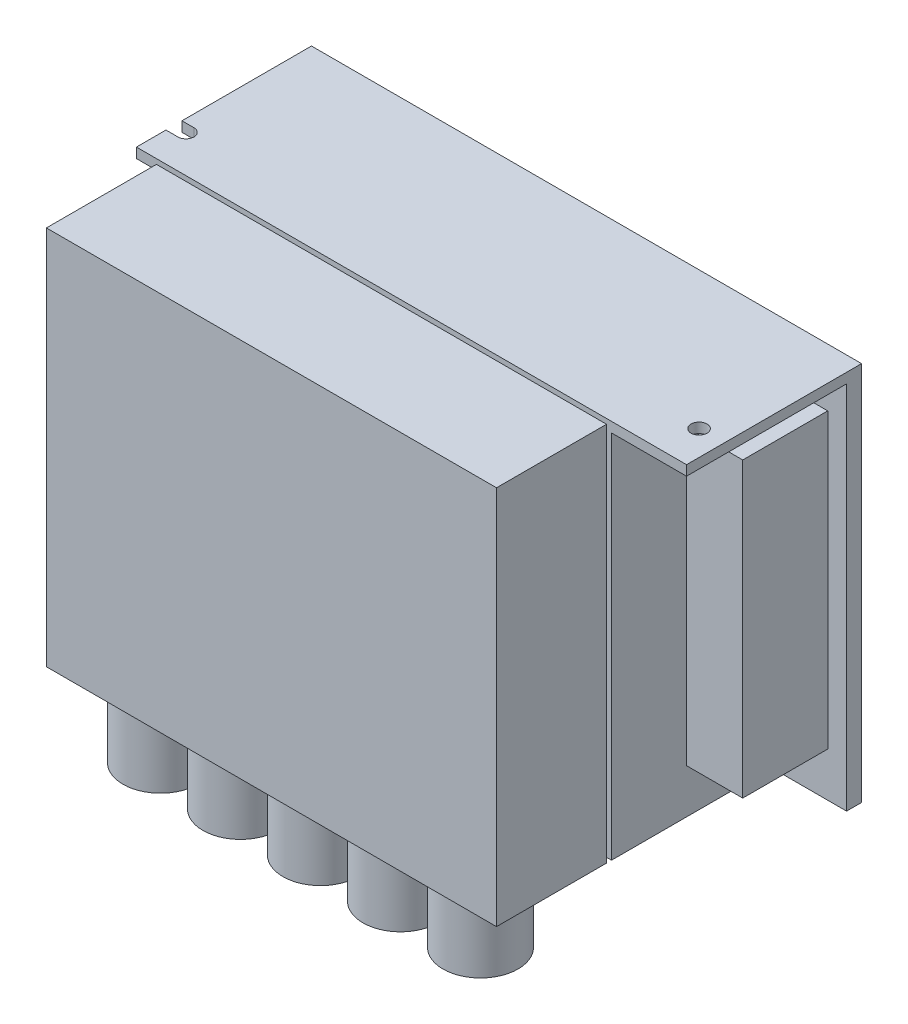
ISO-10303-21;
HEADER;
FILE_DESCRIPTION(('STEP AP214'),'2;1');
FILE_NAME('part.step','',(''),(''),'','','');
FILE_SCHEMA(('AUTOMOTIVE_DESIGN { 1 0 10303 214 1 1 1 1 }'));
ENDSEC;
DATA;
#1=APPLICATION_CONTEXT('core data for automotive mechanical design processes');
#2=APPLICATION_PROTOCOL_DEFINITION('international standard','automotive_design',2000,#1);
#3=PRODUCT_CONTEXT('',#1,'mechanical');
#4=PRODUCT('Part','Part','',(#3));
#5=PRODUCT_RELATED_PRODUCT_CATEGORY('part','',(#4));
#6=PRODUCT_DEFINITION_FORMATION('','',#4);
#7=PRODUCT_DEFINITION_CONTEXT('part definition',#1,'design');
#8=PRODUCT_DEFINITION('design','',#6,#7);
#9=PRODUCT_DEFINITION_SHAPE('','',#8);
#10=(LENGTH_UNIT() NAMED_UNIT(*) SI_UNIT(.MILLI.,.METRE.));
#11=(NAMED_UNIT(*) PLANE_ANGLE_UNIT() SI_UNIT($,.RADIAN.));
#12=(NAMED_UNIT(*) SI_UNIT($,.STERADIAN.) SOLID_ANGLE_UNIT());
#13=UNCERTAINTY_MEASURE_WITH_UNIT(LENGTH_MEASURE(1.E-05),#10,'distance_accuracy_value','');
#14=(GEOMETRIC_REPRESENTATION_CONTEXT(3) GLOBAL_UNCERTAINTY_ASSIGNED_CONTEXT((#13)) GLOBAL_UNIT_ASSIGNED_CONTEXT((#10,
#11,#12)) REPRESENTATION_CONTEXT('',''));
#15=CARTESIAN_POINT('',(0.,0.,0.));
#16=DIRECTION('',(0.,0.,1.));
#17=DIRECTION('',(1.,0.,0.));
#18=AXIS2_PLACEMENT_3D('',#15,#16,#17);
#19=CARTESIAN_POINT('',(-55.,38.,35.));
#20=DIRECTION('',(1.,0.,0.));
#21=DIRECTION('',(0.,1.,0.));
#22=AXIS2_PLACEMENT_3D('',#19,#20,#21);
#23=PLANE('',#22);
#24=DIRECTION('',(0.,0.,-1.));
#25=VECTOR('',#24,1.);
#26=CARTESIAN_POINT('',(-55.,38.,35.));
#27=LINE('',#26,#25);
#28=CARTESIAN_POINT('',(-55.,38.,35.));
#29=VERTEX_POINT('',#28);
#30=CARTESIAN_POINT('',(-55.,38.,29.1));
#31=VERTEX_POINT('',#30);
#32=EDGE_CURVE('E427',#29,#31,#27,.T.);
#33=ORIENTED_EDGE('',*,*,#32,.T.);
#34=DIRECTION('',(0.,-1.,0.));
#35=VECTOR('',#34,1.);
#36=CARTESIAN_POINT('',(-55.,41.,29.1));
#37=LINE('',#36,#35);
#38=CARTESIAN_POINT('',(-55.,36.,29.1));
#39=VERTEX_POINT('',#38);
#40=EDGE_CURVE('E232',#31,#39,#37,.T.);
#41=ORIENTED_EDGE('',*,*,#40,.T.);
#42=DIRECTION('',(0.,0.,1.));
#43=VECTOR('',#42,1.);
#44=CARTESIAN_POINT('',(-55.,36.,3.));
#45=LINE('',#44,#43);
#46=CARTESIAN_POINT('',(-55.,36.,35.));
#47=VERTEX_POINT('',#46);
#48=EDGE_CURVE('E402',#39,#47,#45,.T.);
#49=ORIENTED_EDGE('',*,*,#48,.T.);
#50=DIRECTION('',(0.,-1.,0.));
#51=VECTOR('',#50,1.);
#52=CARTESIAN_POINT('',(-55.,38.,35.));
#53=LINE('',#52,#51);
#54=EDGE_CURVE('E406',#29,#47,#53,.T.);
#55=ORIENTED_EDGE('',*,*,#54,.F.);
#56=EDGE_LOOP('',(#33,#41,#49,#55));
#57=FACE_BOUND('',#56,.T.);
#58=ADVANCED_FACE('F35',(#57),#23,.F.);
#59=CARTESIAN_POINT('',(40.,-38.,3.));
#60=DIRECTION('',(-1.,0.,0.));
#61=DIRECTION('',(0.,0.,1.));
#62=AXIS2_PLACEMENT_3D('',#59,#60,#61);
#63=PLANE('',#62);
#64=DIRECTION('',(0.,0.,-1.));
#65=VECTOR('',#64,1.);
#66=CARTESIAN_POINT('',(40.,-29.125733111252,20.));
#67=LINE('',#66,#65);
#68=CARTESIAN_POINT('',(40.,-29.125733111252,20.));
#69=VERTEX_POINT('',#68);
#70=CARTESIAN_POINT('',(40.,-29.125733111252,3.));
#71=VERTEX_POINT('',#70);
#72=EDGE_CURVE('E355',#69,#71,#67,.T.);
#73=ORIENTED_EDGE('',*,*,#72,.F.);
#74=DIRECTION('',(0.,-1.,0.));
#75=VECTOR('',#74,1.);
#76=CARTESIAN_POINT('',(40.,29.4350158135688,20.));
#77=LINE('',#76,#75);
#78=CARTESIAN_POINT('',(40.,29.4350158135688,20.));
#79=VERTEX_POINT('',#78);
#80=EDGE_CURVE('E332',#79,#69,#77,.T.);
#81=ORIENTED_EDGE('',*,*,#80,.F.);
#82=DIRECTION('',(0.,0.,-1.));
#83=VECTOR('',#82,1.);
#84=CARTESIAN_POINT('',(40.,29.4350158135688,20.));
#85=LINE('',#84,#83);
#86=CARTESIAN_POINT('',(40.,29.4350158135688,3.));
#87=VERTEX_POINT('',#86);
#88=EDGE_CURVE('E342',#79,#87,#85,.T.);
#89=ORIENTED_EDGE('',*,*,#88,.T.);
#90=DIRECTION('',(0.,-1.,0.));
#91=VECTOR('',#90,1.);
#92=CARTESIAN_POINT('',(40.,-38.,3.));
#93=LINE('',#92,#91);
#94=CARTESIAN_POINT('',(40.,36.,3.));
#95=VERTEX_POINT('',#94);
#96=EDGE_CURVE('E366',#95,#87,#93,.T.);
#97=ORIENTED_EDGE('',*,*,#96,.F.);
#98=DIRECTION('',(0.,0.,1.));
#99=VECTOR('',#98,1.);
#100=CARTESIAN_POINT('',(40.,36.,3.));
#101=LINE('',#100,#99);
#102=CARTESIAN_POINT('',(40.,36.,35.));
#103=VERTEX_POINT('',#102);
#104=EDGE_CURVE('E381',#95,#103,#101,.T.);
#105=ORIENTED_EDGE('',*,*,#104,.T.);
#106=DIRECTION('',(0.,-1.,0.));
#107=VECTOR('',#106,1.);
#108=CARTESIAN_POINT('',(40.,-38.,35.));
#109=LINE('',#108,#107);
#110=CARTESIAN_POINT('',(40.,-38.,35.));
#111=VERTEX_POINT('',#110);
#112=EDGE_CURVE('E362',#103,#111,#109,.T.);
#113=ORIENTED_EDGE('',*,*,#112,.T.);
#114=DIRECTION('',(0.,0.,1.));
#115=VECTOR('',#114,1.);
#116=CARTESIAN_POINT('',(40.,-38.,3.));
#117=LINE('',#116,#115);
#118=CARTESIAN_POINT('',(40.,-38.,3.));
#119=VERTEX_POINT('',#118);
#120=EDGE_CURVE('E377',#119,#111,#117,.T.);
#121=ORIENTED_EDGE('',*,*,#120,.F.);
#122=EDGE_CURVE('E365',#71,#119,#93,.T.);
#123=ORIENTED_EDGE('',*,*,#122,.F.);
#124=EDGE_LOOP('',(#73,#81,#89,#97,#105,#113,#121,#123));
#125=FACE_BOUND('',#124,.T.);
#126=ADVANCED_FACE('F490',(#125),#63,.F.);
#127=CARTESIAN_POINT('',(0.,0.,3.));
#128=DIRECTION('',(0.,0.,1.));
#129=DIRECTION('',(1.,0.,0.));
#130=AXIS2_PLACEMENT_3D('',#127,#128,#129);
#131=PLANE('',#130);
#132=DIRECTION('',(0.,1.,0.));
#133=VECTOR('',#132,1.);
#134=CARTESIAN_POINT('',(51.2351832573696,29.4350158135688,3.));
#135=LINE('',#134,#133);
#136=CARTESIAN_POINT('',(51.2351832573696,-29.125733111252,3.));
#137=VERTEX_POINT('',#136);
#138=CARTESIAN_POINT('',(51.2351832573696,29.4350158135688,3.));
#139=VERTEX_POINT('',#138);
#140=EDGE_CURVE('E344',#137,#139,#135,.T.);
#141=ORIENTED_EDGE('',*,*,#140,.F.);
#142=DIRECTION('',(1.,0.,0.));
#143=VECTOR('',#142,1.);
#144=CARTESIAN_POINT('',(40.,-29.125733111252,3.));
#145=LINE('',#144,#143);
#146=EDGE_CURVE('E331',#71,#137,#145,.T.);
#147=ORIENTED_EDGE('',*,*,#146,.F.);
#148=ORIENTED_EDGE('',*,*,#122,.T.);
#149=DIRECTION('',(1.,0.,0.));
#150=VECTOR('',#149,1.);
#151=CARTESIAN_POINT('',(55.,-38.,3.));
#152=LINE('',#151,#150);
#153=CARTESIAN_POINT('',(55.,-38.,3.));
#154=VERTEX_POINT('',#153);
#155=EDGE_CURVE('E369',#119,#154,#152,.T.);
#156=ORIENTED_EDGE('',*,*,#155,.T.);
#157=DIRECTION('',(0.,1.,0.));
#158=VECTOR('',#157,1.);
#159=CARTESIAN_POINT('',(55.,-38.,3.));
#160=LINE('',#159,#158);
#161=CARTESIAN_POINT('',(55.,36.,3.));
#162=VERTEX_POINT('',#161);
#163=EDGE_CURVE('E358',#154,#162,#160,.T.);
#164=ORIENTED_EDGE('',*,*,#163,.T.);
#165=DIRECTION('',(-1.,0.,0.));
#166=VECTOR('',#165,1.);
#167=CARTESIAN_POINT('',(55.,36.,3.));
#168=LINE('',#167,#166);
#169=EDGE_CURVE('E361',#162,#95,#168,.T.);
#170=ORIENTED_EDGE('',*,*,#169,.T.);
#171=ORIENTED_EDGE('',*,*,#96,.T.);
#172=DIRECTION('',(-1.,0.,0.));
#173=VECTOR('',#172,1.);
#174=CARTESIAN_POINT('',(40.,29.4350158135688,3.));
#175=LINE('',#174,#173);
#176=EDGE_CURVE('E336',#139,#87,#175,.T.);
#177=ORIENTED_EDGE('',*,*,#176,.F.);
#178=EDGE_LOOP('',(#141,#147,#148,#156,#164,#170,#171,#177));
#179=FACE_BOUND('',#178,.T.);
#180=ADVANCED_FACE('F495',(#179),#131,.T.);
#181=CARTESIAN_POINT('',(-55.,36.,3.));
#182=VERTEX_POINT('',#181);
#183=CARTESIAN_POINT('',(-55.,36.,25.9));
#184=VERTEX_POINT('',#183);
#185=EDGE_CURVE('E375',#182,#184,#45,.T.);
#186=ORIENTED_EDGE('',*,*,#185,.T.);
#187=DIRECTION('',(0.,-1.,0.));
#188=VECTOR('',#187,1.);
#189=CARTESIAN_POINT('',(-55.,41.,25.9));
#190=LINE('',#189,#188);
#191=CARTESIAN_POINT('',(-55.,38.,25.9));
#192=VERTEX_POINT('',#191);
#193=EDGE_CURVE('E50',#192,#184,#190,.T.);
#194=ORIENTED_EDGE('',*,*,#193,.F.);
#195=CARTESIAN_POINT('',(-55.,38.,0.));
#196=VERTEX_POINT('',#195);
#197=EDGE_CURVE('E417',#192,#196,#27,.T.);
#198=ORIENTED_EDGE('',*,*,#197,.T.);
#199=DIRECTION('',(0.,-1.,0.));
#200=VECTOR('',#199,1.);
#201=CARTESIAN_POINT('',(-55.,38.,0.));
#202=LINE('',#201,#200);
#203=CARTESIAN_POINT('',(-55.,-38.,0.));
#204=VERTEX_POINT('',#203);
#205=EDGE_CURVE('E380',#196,#204,#202,.T.);
#206=ORIENTED_EDGE('',*,*,#205,.T.);
#207=DIRECTION('',(0.,0.,-1.));
#208=VECTOR('',#207,1.);
#209=CARTESIAN_POINT('',(-55.,-38.,35.));
#210=LINE('',#209,#208);
#211=CARTESIAN_POINT('',(-55.,-38.,3.));
#212=VERTEX_POINT('',#211);
#213=EDGE_CURVE('E268',#212,#204,#210,.T.);
#214=ORIENTED_EDGE('',*,*,#213,.F.);
#215=DIRECTION('',(0.,-1.,0.));
#216=VECTOR('',#215,1.);
#217=CARTESIAN_POINT('',(-55.,-38.,3.));
#218=LINE('',#217,#216);
#219=EDGE_CURVE('E384',#182,#212,#218,.T.);
#220=ORIENTED_EDGE('',*,*,#219,.F.);
#221=EDGE_LOOP('',(#186,#194,#198,#206,#214,#220));
#222=FACE_BOUND('',#221,.T.);
#223=ADVANCED_FACE('F37',(#222),#23,.F.);
#224=CARTESIAN_POINT('',(-55.,-38.,35.));
#225=DIRECTION('',(0.,1.,0.));
#226=DIRECTION('',(0.,0.,1.));
#227=AXIS2_PLACEMENT_3D('',#224,#225,#226);
#228=PLANE('',#227);
#229=ORIENTED_EDGE('',*,*,#155,.F.);
#230=ORIENTED_EDGE('',*,*,#120,.T.);
#231=DIRECTION('',(1.,0.,0.));
#232=VECTOR('',#231,1.);
#233=CARTESIAN_POINT('',(-55.,-38.,35.));
#234=LINE('',#233,#232);
#235=CARTESIAN_POINT('',(-50.,-38.,35.));
#236=VERTEX_POINT('',#235);
#237=EDGE_CURVE('E409',#236,#111,#234,.T.);
#238=ORIENTED_EDGE('',*,*,#237,.F.);
#239=DIRECTION('',(0.,0.,1.));
#240=VECTOR('',#239,1.);
#241=CARTESIAN_POINT('',(-50.,-38.,3.));
#242=LINE('',#241,#240);
#243=CARTESIAN_POINT('',(-50.,-38.,3.));
#244=VERTEX_POINT('',#243);
#245=EDGE_CURVE('E396',#244,#236,#242,.T.);
#246=ORIENTED_EDGE('',*,*,#245,.F.);
#247=DIRECTION('',(1.,0.,0.));
#248=VECTOR('',#247,1.);
#249=CARTESIAN_POINT('',(-55.,-38.,3.));
#250=LINE('',#249,#248);
#251=EDGE_CURVE('E386',#212,#244,#250,.T.);
#252=ORIENTED_EDGE('',*,*,#251,.F.);
#253=ORIENTED_EDGE('',*,*,#213,.T.);
#254=DIRECTION('',(1.,0.,0.));
#255=VECTOR('',#254,1.);
#256=CARTESIAN_POINT('',(-55.,-38.,0.));
#257=LINE('',#256,#255);
#258=CARTESIAN_POINT('',(55.,-38.,0.));
#259=VERTEX_POINT('',#258);
#260=EDGE_CURVE('E420',#204,#259,#257,.T.);
#261=ORIENTED_EDGE('',*,*,#260,.T.);
#262=DIRECTION('',(0.,0.,-1.));
#263=VECTOR('',#262,1.);
#264=CARTESIAN_POINT('',(55.,-38.,35.));
#265=LINE('',#264,#263);
#266=EDGE_CURVE('E433',#154,#259,#265,.T.);
#267=ORIENTED_EDGE('',*,*,#266,.F.);
#268=EDGE_LOOP('',(#229,#230,#238,#246,#252,#253,#261,#267));
#269=FACE_BOUND('',#268,.T.);
#270=ADVANCED_FACE('F499',(#269),#228,.F.);
#271=CARTESIAN_POINT('',(55.,38.,35.));
#272=DIRECTION('',(-1.,0.,0.));
#273=DIRECTION('',(0.,0.,1.));
#274=AXIS2_PLACEMENT_3D('',#271,#272,#273);
#275=PLANE('',#274);
#276=DIRECTION('',(0.,1.,0.));
#277=VECTOR('',#276,1.);
#278=CARTESIAN_POINT('',(55.,38.,35.));
#279=LINE('',#278,#277);
#280=CARTESIAN_POINT('',(55.,36.,35.));
#281=VERTEX_POINT('',#280);
#282=CARTESIAN_POINT('',(55.,38.,35.));
#283=VERTEX_POINT('',#282);
#284=EDGE_CURVE('E413',#281,#283,#279,.T.);
#285=ORIENTED_EDGE('',*,*,#284,.F.);
#286=DIRECTION('',(0.,0.,1.));
#287=VECTOR('',#286,1.);
#288=CARTESIAN_POINT('',(55.,36.,3.));
#289=LINE('',#288,#287);
#290=EDGE_CURVE('E371',#162,#281,#289,.T.);
#291=ORIENTED_EDGE('',*,*,#290,.F.);
#292=ORIENTED_EDGE('',*,*,#163,.F.);
#293=ORIENTED_EDGE('',*,*,#266,.T.);
#294=DIRECTION('',(0.,1.,0.));
#295=VECTOR('',#294,1.);
#296=CARTESIAN_POINT('',(55.,38.,0.));
#297=LINE('',#296,#295);
#298=CARTESIAN_POINT('',(55.,38.,0.));
#299=VERTEX_POINT('',#298);
#300=EDGE_CURVE('E423',#259,#299,#297,.T.);
#301=ORIENTED_EDGE('',*,*,#300,.T.);
#302=DIRECTION('',(0.,0.,-1.));
#303=VECTOR('',#302,1.);
#304=CARTESIAN_POINT('',(55.,38.,35.));
#305=LINE('',#304,#303);
#306=EDGE_CURVE('E430',#283,#299,#305,.T.);
#307=ORIENTED_EDGE('',*,*,#306,.F.);
#308=EDGE_LOOP('',(#285,#291,#292,#293,#301,#307));
#309=FACE_BOUND('',#308,.T.);
#310=ADVANCED_FACE('F505',(#309),#275,.F.);
#311=CARTESIAN_POINT('',(-55.,38.,35.));
#312=DIRECTION('',(0.,-1.,0.));
#313=DIRECTION('',(0.,0.,-1.));
#314=AXIS2_PLACEMENT_3D('',#311,#312,#313);
#315=PLANE('',#314);
#316=CARTESIAN_POINT('',(50.,38.,27.5));
#317=DIRECTION('',(0.,-1.,0.));
#318=DIRECTION('',(0.,0.,-1.));
#319=AXIS2_PLACEMENT_3D('',#316,#317,#318);
#320=CIRCLE('',#319,1.6);
#321=CARTESIAN_POINT('',(50.,38.,25.9));
#322=VERTEX_POINT('',#321);
#323=EDGE_CURVE('E235',#322,#322,#320,.T.);
#324=ORIENTED_EDGE('',*,*,#323,.T.);
#325=EDGE_LOOP('',(#324));
#326=FACE_BOUND('',#325,.T.);
#327=CARTESIAN_POINT('',(-52.6,38.,27.5));
#328=DIRECTION('',(0.,-1.,0.));
#329=DIRECTION('',(0.,0.,-1.));
#330=AXIS2_PLACEMENT_3D('',#327,#328,#329);
#331=CIRCLE('',#330,1.6);
#332=CARTESIAN_POINT('',(-52.6,38.,25.9));
#333=VERTEX_POINT('',#332);
#334=CARTESIAN_POINT('',(-52.6,38.,29.1));
#335=VERTEX_POINT('',#334);
#336=EDGE_CURVE('E216',#333,#335,#331,.T.);
#337=ORIENTED_EDGE('',*,*,#336,.T.);
#338=DIRECTION('',(-1.,0.,0.));
#339=VECTOR('',#338,1.);
#340=CARTESIAN_POINT('',(-55.,38.,29.1));
#341=LINE('',#340,#339);
#342=EDGE_CURVE('E245',#335,#31,#341,.T.);
#343=ORIENTED_EDGE('',*,*,#342,.T.);
#344=ORIENTED_EDGE('',*,*,#32,.F.);
#345=DIRECTION('',(-1.,0.,0.));
#346=VECTOR('',#345,1.);
#347=CARTESIAN_POINT('',(-55.,38.,35.));
#348=LINE('',#347,#346);
#349=EDGE_CURVE('E415',#283,#29,#348,.T.);
#350=ORIENTED_EDGE('',*,*,#349,.F.);
#351=ORIENTED_EDGE('',*,*,#306,.T.);
#352=DIRECTION('',(-1.,0.,0.));
#353=VECTOR('',#352,1.);
#354=CARTESIAN_POINT('',(-55.,38.,0.));
#355=LINE('',#354,#353);
#356=EDGE_CURVE('E410',#299,#196,#355,.T.);
#357=ORIENTED_EDGE('',*,*,#356,.T.);
#358=ORIENTED_EDGE('',*,*,#197,.F.);
#359=DIRECTION('',(1.,0.,0.));
#360=VECTOR('',#359,1.);
#361=CARTESIAN_POINT('',(-55.,38.,25.9));
#362=LINE('',#361,#360);
#363=EDGE_CURVE('E242',#192,#333,#362,.T.);
#364=ORIENTED_EDGE('',*,*,#363,.T.);
#365=EDGE_LOOP('',(#337,#343,#344,#350,#351,#357,#358,#364));
#366=FACE_BOUND('',#365,.T.);
#367=ADVANCED_FACE('F530',(#326,#366),#315,.F.);
#368=CARTESIAN_POINT('',(0.,0.,35.));
#369=DIRECTION('',(0.,0.,1.));
#370=DIRECTION('',(1.,0.,0.));
#371=AXIS2_PLACEMENT_3D('',#368,#369,#370);
#372=PLANE('',#371);
#373=DIRECTION('',(0.,-1.,0.));
#374=VECTOR('',#373,1.);
#375=CARTESIAN_POINT('',(-47.3039953203901,36.2035052903485,35.));
#376=LINE('',#375,#374);
#377=CARTESIAN_POINT('',(-47.3039953203901,36.2035052903485,35.));
#378=VERTEX_POINT('',#377);
#379=CARTESIAN_POINT('',(-47.3039953203901,-35.6758273407318,35.));
#380=VERTEX_POINT('',#379);
#381=EDGE_CURVE('E58',#378,#380,#376,.T.);
#382=ORIENTED_EDGE('',*,*,#381,.F.);
#383=DIRECTION('',(-1.,0.,0.));
#384=VECTOR('',#383,1.);
#385=CARTESIAN_POINT('',(-47.3039953203901,36.2035052903485,35.));
#386=LINE('',#385,#384);
#387=CARTESIAN_POINT('',(37.9234408806801,36.2035052903485,35.));
#388=VERTEX_POINT('',#387);
#389=EDGE_CURVE('E302',#388,#378,#386,.T.);
#390=ORIENTED_EDGE('',*,*,#389,.F.);
#391=DIRECTION('',(0.,1.,0.));
#392=VECTOR('',#391,1.);
#393=CARTESIAN_POINT('',(37.9234408806801,36.2035052903485,35.));
#394=LINE('',#393,#392);
#395=CARTESIAN_POINT('',(37.9234408806801,-35.6758273407318,35.));
#396=VERTEX_POINT('',#395);
#397=EDGE_CURVE('E316',#396,#388,#394,.T.);
#398=ORIENTED_EDGE('',*,*,#397,.F.);
#399=DIRECTION('',(1.,0.,0.));
#400=VECTOR('',#399,1.);
#401=CARTESIAN_POINT('',(-47.3039953203901,-35.6758273407318,35.));
#402=LINE('',#401,#400);
#403=EDGE_CURVE('E313',#380,#396,#402,.T.);
#404=ORIENTED_EDGE('',*,*,#403,.F.);
#405=EDGE_LOOP('',(#382,#390,#398,#404));
#406=FACE_BOUND('',#405,.T.);
#407=ORIENTED_EDGE('',*,*,#112,.F.);
#408=DIRECTION('',(-1.,0.,0.));
#409=VECTOR('',#408,1.);
#410=CARTESIAN_POINT('',(55.,36.,35.));
#411=LINE('',#410,#409);
#412=EDGE_CURVE('E372',#281,#103,#411,.T.);
#413=ORIENTED_EDGE('',*,*,#412,.F.);
#414=ORIENTED_EDGE('',*,*,#284,.T.);
#415=ORIENTED_EDGE('',*,*,#349,.T.);
#416=ORIENTED_EDGE('',*,*,#54,.T.);
#417=DIRECTION('',(-1.,0.,0.));
#418=VECTOR('',#417,1.);
#419=CARTESIAN_POINT('',(-55.,36.,35.));
#420=LINE('',#419,#418);
#421=CARTESIAN_POINT('',(-50.,36.,35.));
#422=VERTEX_POINT('',#421);
#423=EDGE_CURVE('E387',#422,#47,#420,.T.);
#424=ORIENTED_EDGE('',*,*,#423,.F.);
#425=DIRECTION('',(0.,1.,0.));
#426=VECTOR('',#425,1.);
#427=CARTESIAN_POINT('',(-50.,-38.,35.));
#428=LINE('',#427,#426);
#429=EDGE_CURVE('E357',#236,#422,#428,.T.);
#430=ORIENTED_EDGE('',*,*,#429,.F.);
#431=ORIENTED_EDGE('',*,*,#237,.T.);
#432=EDGE_LOOP('',(#407,#413,#414,#415,#416,#424,#430,#431));
#433=FACE_BOUND('',#432,.T.);
#434=ADVANCED_FACE('F524',(#406,#433),#372,.T.);
#435=CARTESIAN_POINT('',(0.,0.,0.));
#436=DIRECTION('',(0.,0.,1.));
#437=DIRECTION('',(1.,0.,0.));
#438=AXIS2_PLACEMENT_3D('',#435,#436,#437);
#439=PLANE('',#438);
#440=ORIENTED_EDGE('',*,*,#205,.F.);
#441=ORIENTED_EDGE('',*,*,#356,.F.);
#442=ORIENTED_EDGE('',*,*,#300,.F.);
#443=ORIENTED_EDGE('',*,*,#260,.F.);
#444=EDGE_LOOP('',(#440,#441,#442,#443));
#445=FACE_BOUND('',#444,.T.);
#446=ADVANCED_FACE('F535',(#445),#439,.F.);
#447=CARTESIAN_POINT('',(-55.,36.,3.));
#448=DIRECTION('',(0.,1.,0.));
#449=DIRECTION('',(0.,0.,1.));
#450=AXIS2_PLACEMENT_3D('',#447,#448,#449);
#451=PLANE('',#450);
#452=ORIENTED_EDGE('',*,*,#48,.F.);
#453=DIRECTION('',(-1.,0.,0.));
#454=VECTOR('',#453,1.);
#455=CARTESIAN_POINT('',(-55.,36.,29.1));
#456=LINE('',#455,#454);
#457=CARTESIAN_POINT('',(-52.6,36.,29.1));
#458=VERTEX_POINT('',#457);
#459=EDGE_CURVE('E228',#458,#39,#456,.T.);
#460=ORIENTED_EDGE('',*,*,#459,.F.);
#461=CARTESIAN_POINT('',(-52.6,36.,27.5));
#462=DIRECTION('',(0.,-1.,0.));
#463=DIRECTION('',(0.,0.,-1.));
#464=AXIS2_PLACEMENT_3D('',#461,#462,#463);
#465=CIRCLE('',#464,1.6);
#466=CARTESIAN_POINT('',(-52.6,36.,25.9));
#467=VERTEX_POINT('',#466);
#468=EDGE_CURVE('E213',#467,#458,#465,.T.);
#469=ORIENTED_EDGE('',*,*,#468,.F.);
#470=DIRECTION('',(1.,0.,0.));
#471=VECTOR('',#470,1.);
#472=CARTESIAN_POINT('',(-55.,36.,25.9));
#473=LINE('',#472,#471);
#474=EDGE_CURVE('E220',#184,#467,#473,.T.);
#475=ORIENTED_EDGE('',*,*,#474,.F.);
#476=ORIENTED_EDGE('',*,*,#185,.F.);
#477=DIRECTION('',(-1.,0.,0.));
#478=VECTOR('',#477,1.);
#479=CARTESIAN_POINT('',(-55.,36.,3.));
#480=LINE('',#479,#478);
#481=CARTESIAN_POINT('',(-50.,36.,3.));
#482=VERTEX_POINT('',#481);
#483=EDGE_CURVE('E393',#482,#182,#480,.T.);
#484=ORIENTED_EDGE('',*,*,#483,.F.);
#485=DIRECTION('',(0.,0.,1.));
#486=VECTOR('',#485,1.);
#487=CARTESIAN_POINT('',(-50.,36.,3.));
#488=LINE('',#487,#486);
#489=EDGE_CURVE('E403',#482,#422,#488,.T.);
#490=ORIENTED_EDGE('',*,*,#489,.T.);
#491=ORIENTED_EDGE('',*,*,#423,.T.);
#492=EDGE_LOOP('',(#452,#460,#469,#475,#476,#484,#490,#491));
#493=FACE_BOUND('',#492,.T.);
#494=ADVANCED_FACE('F227',(#493),#451,.F.);
#495=CARTESIAN_POINT('',(-50.,-38.,3.));
#496=DIRECTION('',(1.,0.,0.));
#497=DIRECTION('',(0.,0.,-1.));
#498=AXIS2_PLACEMENT_3D('',#495,#496,#497);
#499=PLANE('',#498);
#500=ORIENTED_EDGE('',*,*,#429,.T.);
#501=ORIENTED_EDGE('',*,*,#489,.F.);
#502=DIRECTION('',(0.,1.,0.));
#503=VECTOR('',#502,1.);
#504=CARTESIAN_POINT('',(-50.,-38.,3.));
#505=LINE('',#504,#503);
#506=EDGE_CURVE('E390',#244,#482,#505,.T.);
#507=ORIENTED_EDGE('',*,*,#506,.F.);
#508=ORIENTED_EDGE('',*,*,#245,.T.);
#509=EDGE_LOOP('',(#500,#501,#507,#508));
#510=FACE_BOUND('',#509,.T.);
#511=ADVANCED_FACE('F518',(#510),#499,.F.);
#512=CARTESIAN_POINT('',(0.,0.,3.));
#513=DIRECTION('',(0.,0.,-1.));
#514=DIRECTION('',(-1.,0.,0.));
#515=AXIS2_PLACEMENT_3D('',#512,#513,#514);
#516=PLANE('',#515);
#517=ORIENTED_EDGE('',*,*,#219,.T.);
#518=ORIENTED_EDGE('',*,*,#251,.T.);
#519=ORIENTED_EDGE('',*,*,#506,.T.);
#520=ORIENTED_EDGE('',*,*,#483,.T.);
#521=EDGE_LOOP('',(#517,#518,#519,#520));
#522=FACE_BOUND('',#521,.T.);
#523=ADVANCED_FACE('F514',(#522),#516,.F.);
#524=CARTESIAN_POINT('',(55.,36.,3.));
#525=DIRECTION('',(0.,1.,0.));
#526=DIRECTION('',(0.,0.,1.));
#527=AXIS2_PLACEMENT_3D('',#524,#525,#526);
#528=PLANE('',#527);
#529=CARTESIAN_POINT('',(50.,36.,27.5));
#530=DIRECTION('',(0.,-1.,0.));
#531=DIRECTION('',(0.,0.,-1.));
#532=AXIS2_PLACEMENT_3D('',#529,#530,#531);
#533=CIRCLE('',#532,1.6);
#534=CARTESIAN_POINT('',(50.,36.,25.9));
#535=VERTEX_POINT('',#534);
#536=EDGE_CURVE('E224',#535,#535,#533,.T.);
#537=ORIENTED_EDGE('',*,*,#536,.F.);
#538=EDGE_LOOP('',(#537));
#539=FACE_BOUND('',#538,.T.);
#540=ORIENTED_EDGE('',*,*,#412,.T.);
#541=ORIENTED_EDGE('',*,*,#104,.F.);
#542=ORIENTED_EDGE('',*,*,#169,.F.);
#543=ORIENTED_EDGE('',*,*,#290,.T.);
#544=EDGE_LOOP('',(#540,#541,#542,#543));
#545=FACE_BOUND('',#544,.T.);
#546=ADVANCED_FACE('F547',(#539,#545),#528,.F.);
#547=CARTESIAN_POINT('',(40.,-29.125733111252,20.));
#548=DIRECTION('',(0.,1.,0.));
#549=DIRECTION('',(0.,0.,1.));
#550=AXIS2_PLACEMENT_3D('',#547,#548,#549);
#551=PLANE('',#550);
#552=ORIENTED_EDGE('',*,*,#146,.T.);
#553=DIRECTION('',(0.,0.,-1.));
#554=VECTOR('',#553,1.);
#555=CARTESIAN_POINT('',(51.2351832573696,-29.125733111252,20.));
#556=LINE('',#555,#554);
#557=CARTESIAN_POINT('',(51.2351832573696,-29.125733111252,20.));
#558=VERTEX_POINT('',#557);
#559=EDGE_CURVE('E352',#558,#137,#556,.T.);
#560=ORIENTED_EDGE('',*,*,#559,.F.);
#561=DIRECTION('',(1.,0.,0.));
#562=VECTOR('',#561,1.);
#563=CARTESIAN_POINT('',(40.,-29.125733111252,20.));
#564=LINE('',#563,#562);
#565=EDGE_CURVE('E335',#69,#558,#564,.T.);
#566=ORIENTED_EDGE('',*,*,#565,.F.);
#567=ORIENTED_EDGE('',*,*,#72,.T.);
#568=EDGE_LOOP('',(#552,#560,#566,#567));
#569=FACE_BOUND('',#568,.T.);
#570=ADVANCED_FACE('F556',(#569),#551,.F.);
#571=CARTESIAN_POINT('',(51.2351832573696,29.4350158135688,20.));
#572=DIRECTION('',(-1.,0.,0.));
#573=DIRECTION('',(0.,0.,1.));
#574=AXIS2_PLACEMENT_3D('',#571,#572,#573);
#575=PLANE('',#574);
#576=ORIENTED_EDGE('',*,*,#140,.T.);
#577=DIRECTION('',(0.,0.,-1.));
#578=VECTOR('',#577,1.);
#579=CARTESIAN_POINT('',(51.2351832573696,29.4350158135688,20.));
#580=LINE('',#579,#578);
#581=CARTESIAN_POINT('',(51.2351832573696,29.4350158135688,20.));
#582=VERTEX_POINT('',#581);
#583=EDGE_CURVE('E350',#582,#139,#580,.T.);
#584=ORIENTED_EDGE('',*,*,#583,.F.);
#585=DIRECTION('',(0.,1.,0.));
#586=VECTOR('',#585,1.);
#587=CARTESIAN_POINT('',(51.2351832573696,29.4350158135688,20.));
#588=LINE('',#587,#586);
#589=EDGE_CURVE('E338',#558,#582,#588,.T.);
#590=ORIENTED_EDGE('',*,*,#589,.F.);
#591=ORIENTED_EDGE('',*,*,#559,.T.);
#592=EDGE_LOOP('',(#576,#584,#590,#591));
#593=FACE_BOUND('',#592,.T.);
#594=ADVANCED_FACE('F568',(#593),#575,.F.);
#595=CARTESIAN_POINT('',(40.,29.4350158135688,20.));
#596=DIRECTION('',(0.,-1.,0.));
#597=DIRECTION('',(0.,0.,-1.));
#598=AXIS2_PLACEMENT_3D('',#595,#596,#597);
#599=PLANE('',#598);
#600=ORIENTED_EDGE('',*,*,#176,.T.);
#601=ORIENTED_EDGE('',*,*,#88,.F.);
#602=DIRECTION('',(-1.,0.,0.));
#603=VECTOR('',#602,1.);
#604=CARTESIAN_POINT('',(40.,29.4350158135688,20.));
#605=LINE('',#604,#603);
#606=EDGE_CURVE('E340',#582,#79,#605,.T.);
#607=ORIENTED_EDGE('',*,*,#606,.F.);
#608=ORIENTED_EDGE('',*,*,#583,.T.);
#609=EDGE_LOOP('',(#600,#601,#607,#608));
#610=FACE_BOUND('',#609,.T.);
#611=ADVANCED_FACE('F565',(#610),#599,.F.);
#612=CARTESIAN_POINT('',(0.,0.,20.));
#613=DIRECTION('',(0.,0.,1.));
#614=DIRECTION('',(1.,0.,0.));
#615=AXIS2_PLACEMENT_3D('',#612,#613,#614);
#616=PLANE('',#615);
#617=ORIENTED_EDGE('',*,*,#80,.T.);
#618=ORIENTED_EDGE('',*,*,#565,.T.);
#619=ORIENTED_EDGE('',*,*,#589,.T.);
#620=ORIENTED_EDGE('',*,*,#606,.T.);
#621=EDGE_LOOP('',(#617,#618,#619,#620));
#622=FACE_BOUND('',#621,.T.);
#623=ADVANCED_FACE('F560',(#622),#616,.T.);
#624=CARTESIAN_POINT('',(-47.3039953203901,36.2035052903485,36.));
#625=DIRECTION('',(1.,0.,0.));
#626=DIRECTION('',(0.,1.,0.));
#627=AXIS2_PLACEMENT_3D('',#624,#625,#626);
#628=PLANE('',#627);
#629=ORIENTED_EDGE('',*,*,#381,.T.);
#630=DIRECTION('',(0.,0.,-1.));
#631=VECTOR('',#630,1.);
#632=CARTESIAN_POINT('',(-47.3039953203901,-35.6758273407318,36.));
#633=LINE('',#632,#631);
#634=CARTESIAN_POINT('',(-47.3039953203901,-35.6758273407318,36.));
#635=VERTEX_POINT('',#634);
#636=EDGE_CURVE('E328',#635,#380,#633,.T.);
#637=ORIENTED_EDGE('',*,*,#636,.F.);
#638=DIRECTION('',(0.,-1.,0.));
#639=VECTOR('',#638,1.);
#640=CARTESIAN_POINT('',(-47.3039953203901,36.2035052903485,36.));
#641=LINE('',#640,#639);
#642=CARTESIAN_POINT('',(-47.3039953203901,36.2035052903485,36.));
#643=VERTEX_POINT('',#642);
#644=EDGE_CURVE('E298',#643,#635,#641,.T.);
#645=ORIENTED_EDGE('',*,*,#644,.F.);
#646=DIRECTION('',(0.,0.,-1.));
#647=VECTOR('',#646,1.);
#648=CARTESIAN_POINT('',(-47.3039953203901,36.2035052903485,36.));
#649=LINE('',#648,#647);
#650=EDGE_CURVE('E311',#643,#378,#649,.T.);
#651=ORIENTED_EDGE('',*,*,#650,.T.);
#652=EDGE_LOOP('',(#629,#637,#645,#651));
#653=FACE_BOUND('',#652,.T.);
#654=ADVANCED_FACE('F657',(#653),#628,.F.);
#655=CARTESIAN_POINT('',(-47.3039953203901,-35.6758273407318,36.));
#656=DIRECTION('',(0.,1.,0.));
#657=DIRECTION('',(0.,0.,1.));
#658=AXIS2_PLACEMENT_3D('',#655,#656,#657);
#659=PLANE('',#658);
#660=ORIENTED_EDGE('',*,*,#403,.T.);
#661=DIRECTION('',(0.,0.,-1.));
#662=VECTOR('',#661,1.);
#663=CARTESIAN_POINT('',(37.9234408806801,-35.6758273407318,36.));
#664=LINE('',#663,#662);
#665=CARTESIAN_POINT('',(37.9234408806801,-35.6758273407318,36.));
#666=VERTEX_POINT('',#665);
#667=EDGE_CURVE('E325',#666,#396,#664,.T.);
#668=ORIENTED_EDGE('',*,*,#667,.F.);
#669=DIRECTION('',(1.,0.,0.));
#670=VECTOR('',#669,1.);
#671=CARTESIAN_POINT('',(-47.3039953203901,-35.6758273407318,36.));
#672=LINE('',#671,#670);
#673=EDGE_CURVE('E301',#635,#666,#672,.T.);
#674=ORIENTED_EDGE('',*,*,#673,.F.);
#675=ORIENTED_EDGE('',*,*,#636,.T.);
#676=EDGE_LOOP('',(#660,#668,#674,#675));
#677=FACE_BOUND('',#676,.T.);
#678=ADVANCED_FACE('F665',(#677),#659,.F.);
#679=CARTESIAN_POINT('',(37.9234408806801,36.2035052903485,36.));
#680=DIRECTION('',(-1.,0.,0.));
#681=DIRECTION('',(0.,0.,1.));
#682=AXIS2_PLACEMENT_3D('',#679,#680,#681);
#683=PLANE('',#682);
#684=ORIENTED_EDGE('',*,*,#397,.T.);
#685=DIRECTION('',(0.,0.,-1.));
#686=VECTOR('',#685,1.);
#687=CARTESIAN_POINT('',(37.9234408806801,36.2035052903485,36.));
#688=LINE('',#687,#686);
#689=CARTESIAN_POINT('',(37.9234408806801,36.2035052903485,36.));
#690=VERTEX_POINT('',#689);
#691=EDGE_CURVE('E322',#690,#388,#688,.T.);
#692=ORIENTED_EDGE('',*,*,#691,.F.);
#693=DIRECTION('',(0.,1.,0.));
#694=VECTOR('',#693,1.);
#695=CARTESIAN_POINT('',(37.9234408806801,36.2035052903485,36.));
#696=LINE('',#695,#694);
#697=EDGE_CURVE('E305',#666,#690,#696,.T.);
#698=ORIENTED_EDGE('',*,*,#697,.F.);
#699=ORIENTED_EDGE('',*,*,#667,.T.);
#700=EDGE_LOOP('',(#684,#692,#698,#699));
#701=FACE_BOUND('',#700,.T.);
#702=ADVANCED_FACE('F672',(#701),#683,.F.);
#703=CARTESIAN_POINT('',(-47.3039953203901,36.2035052903485,36.));
#704=DIRECTION('',(0.,-1.,0.));
#705=DIRECTION('',(0.,0.,-1.));
#706=AXIS2_PLACEMENT_3D('',#703,#704,#705);
#707=PLANE('',#706);
#708=ORIENTED_EDGE('',*,*,#389,.T.);
#709=ORIENTED_EDGE('',*,*,#650,.F.);
#710=DIRECTION('',(-1.,0.,0.));
#711=VECTOR('',#710,1.);
#712=CARTESIAN_POINT('',(-47.3039953203901,36.2035052903485,36.));
#713=LINE('',#712,#711);
#714=EDGE_CURVE('E308',#690,#643,#713,.T.);
#715=ORIENTED_EDGE('',*,*,#714,.F.);
#716=ORIENTED_EDGE('',*,*,#691,.T.);
#717=EDGE_LOOP('',(#708,#709,#715,#716));
#718=FACE_BOUND('',#717,.T.);
#719=ADVANCED_FACE('F680',(#718),#707,.F.);
#720=CARTESIAN_POINT('',(0.,0.,36.));
#721=DIRECTION('',(0.,0.,1.));
#722=DIRECTION('',(1.,0.,0.));
#723=AXIS2_PLACEMENT_3D('',#720,#721,#722);
#724=PLANE('',#723);
#725=DIRECTION('',(0.,-1.,0.));
#726=VECTOR('',#725,1.);
#727=CARTESIAN_POINT('',(-50.,38.,36.));
#728=LINE('',#727,#726);
#729=CARTESIAN_POINT('',(-50.,38.,36.));
#730=VERTEX_POINT('',#729);
#731=CARTESIAN_POINT('',(-50.,-38.,36.));
#732=VERTEX_POINT('',#731);
#733=EDGE_CURVE('E263',#730,#732,#728,.T.);
#734=ORIENTED_EDGE('',*,*,#733,.F.);
#735=DIRECTION('',(-1.,0.,0.));
#736=VECTOR('',#735,1.);
#737=CARTESIAN_POINT('',(-50.,38.,36.));
#738=LINE('',#737,#736);
#739=CARTESIAN_POINT('',(40.,38.,36.));
#740=VERTEX_POINT('',#739);
#741=EDGE_CURVE('E273',#740,#730,#738,.T.);
#742=ORIENTED_EDGE('',*,*,#741,.F.);
#743=DIRECTION('',(0.,1.,0.));
#744=VECTOR('',#743,1.);
#745=CARTESIAN_POINT('',(40.,38.,36.));
#746=LINE('',#745,#744);
#747=CARTESIAN_POINT('',(40.,-38.,36.));
#748=VERTEX_POINT('',#747);
#749=EDGE_CURVE('E284',#748,#740,#746,.T.);
#750=ORIENTED_EDGE('',*,*,#749,.F.);
#751=DIRECTION('',(1.,0.,0.));
#752=VECTOR('',#751,1.);
#753=CARTESIAN_POINT('',(-50.,-38.,36.));
#754=LINE('',#753,#752);
#755=EDGE_CURVE('E282',#732,#748,#754,.T.);
#756=ORIENTED_EDGE('',*,*,#755,.F.);
#757=EDGE_LOOP('',(#734,#742,#750,#756));
#758=FACE_BOUND('',#757,.T.);
#759=ORIENTED_EDGE('',*,*,#714,.T.);
#760=ORIENTED_EDGE('',*,*,#644,.T.);
#761=ORIENTED_EDGE('',*,*,#673,.T.);
#762=ORIENTED_EDGE('',*,*,#697,.T.);
#763=EDGE_LOOP('',(#759,#760,#761,#762));
#764=FACE_BOUND('',#763,.T.);
#765=ADVANCED_FACE('F467',(#758,#764),#724,.F.);
#766=CARTESIAN_POINT('',(-50.,38.,58.));
#767=DIRECTION('',(1.,0.,0.));
#768=DIRECTION('',(0.,1.,0.));
#769=AXIS2_PLACEMENT_3D('',#766,#767,#768);
#770=PLANE('',#769);
#771=ORIENTED_EDGE('',*,*,#733,.T.);
#772=DIRECTION('',(0.,0.,-1.));
#773=VECTOR('',#772,1.);
#774=CARTESIAN_POINT('',(-50.,-38.,58.));
#775=LINE('',#774,#773);
#776=CARTESIAN_POINT('',(-50.,-38.,58.));
#777=VERTEX_POINT('',#776);
#778=EDGE_CURVE('E295',#777,#732,#775,.T.);
#779=ORIENTED_EDGE('',*,*,#778,.F.);
#780=DIRECTION('',(0.,-1.,0.));
#781=VECTOR('',#780,1.);
#782=CARTESIAN_POINT('',(-50.,38.,58.));
#783=LINE('',#782,#781);
#784=CARTESIAN_POINT('',(-50.,38.,58.));
#785=VERTEX_POINT('',#784);
#786=EDGE_CURVE('E269',#785,#777,#783,.T.);
#787=ORIENTED_EDGE('',*,*,#786,.F.);
#788=DIRECTION('',(0.,0.,-1.));
#789=VECTOR('',#788,1.);
#790=CARTESIAN_POINT('',(-50.,38.,58.));
#791=LINE('',#790,#789);
#792=EDGE_CURVE('E279',#785,#730,#791,.T.);
#793=ORIENTED_EDGE('',*,*,#792,.T.);
#794=EDGE_LOOP('',(#771,#779,#787,#793));
#795=FACE_BOUND('',#794,.T.);
#796=ADVANCED_FACE('F449',(#795),#770,.F.);
#797=CARTESIAN_POINT('',(-50.,-38.,58.));
#798=DIRECTION('',(0.,1.,0.));
#799=DIRECTION('',(0.,0.,1.));
#800=AXIS2_PLACEMENT_3D('',#797,#798,#799);
#801=PLANE('',#800);
#802=CARTESIAN_POINT('',(-37.,-38.,48.2));
#803=DIRECTION('',(0.,1.,0.));
#804=DIRECTION('',(0.,0.,1.));
#805=AXIS2_PLACEMENT_3D('',#802,#803,#804);
#806=CIRCLE('',#805,7.5);
#807=CARTESIAN_POINT('',(-37.,-38.,55.7));
#808=VERTEX_POINT('',#807);
#809=EDGE_CURVE('E11',#808,#808,#806,.F.);
#810=ORIENTED_EDGE('',*,*,#809,.F.);
#811=EDGE_LOOP('',(#810));
#812=FACE_BOUND('',#811,.T.);
#813=CARTESIAN_POINT('',(-21.,-38.,48.2));
#814=DIRECTION('',(0.,1.,0.));
#815=DIRECTION('',(0.,0.,1.));
#816=AXIS2_PLACEMENT_3D('',#813,#814,#815);
#817=CIRCLE('',#816,7.5);
#818=CARTESIAN_POINT('',(-21.,-38.,55.7));
#819=VERTEX_POINT('',#818);
#820=EDGE_CURVE('E43',#819,#819,#817,.F.);
#821=ORIENTED_EDGE('',*,*,#820,.F.);
#822=EDGE_LOOP('',(#821));
#823=FACE_BOUND('',#822,.T.);
#824=CARTESIAN_POINT('',(27.,-38.,48.2));
#825=DIRECTION('',(0.,1.,0.));
#826=DIRECTION('',(0.,0.,1.));
#827=AXIS2_PLACEMENT_3D('',#824,#825,#826);
#828=CIRCLE('',#827,7.5);
#829=CARTESIAN_POINT('',(27.,-38.,55.7));
#830=VERTEX_POINT('',#829);
#831=EDGE_CURVE('E438',#830,#830,#828,.F.);
#832=ORIENTED_EDGE('',*,*,#831,.F.);
#833=EDGE_LOOP('',(#832));
#834=FACE_BOUND('',#833,.T.);
#835=CARTESIAN_POINT('',(11.,-38.,48.2));
#836=DIRECTION('',(0.,1.,0.));
#837=DIRECTION('',(0.,0.,1.));
#838=AXIS2_PLACEMENT_3D('',#835,#836,#837);
#839=CIRCLE('',#838,7.5);
#840=CARTESIAN_POINT('',(11.,-38.,55.7));
#841=VERTEX_POINT('',#840);
#842=EDGE_CURVE('E267',#841,#841,#839,.F.);
#843=ORIENTED_EDGE('',*,*,#842,.F.);
#844=EDGE_LOOP('',(#843));
#845=FACE_BOUND('',#844,.T.);
#846=CARTESIAN_POINT('',(-4.99999999999999,-38.,48.2));
#847=DIRECTION('',(0.,-1.,0.));
#848=DIRECTION('',(0.,0.,-1.));
#849=AXIS2_PLACEMENT_3D('',#846,#847,#848);
#850=CIRCLE('',#849,7.5);
#851=CARTESIAN_POINT('',(-4.99999999999999,-38.,40.7));
#852=VERTEX_POINT('',#851);
#853=EDGE_CURVE('E264',#852,#852,#850,.T.);
#854=ORIENTED_EDGE('',*,*,#853,.F.);
#855=EDGE_LOOP('',(#854));
#856=FACE_BOUND('',#855,.T.);
#857=ORIENTED_EDGE('',*,*,#755,.T.);
#858=DIRECTION('',(0.,0.,-1.));
#859=VECTOR('',#858,1.);
#860=CARTESIAN_POINT('',(40.,-38.,58.));
#861=LINE('',#860,#859);
#862=CARTESIAN_POINT('',(40.,-38.,58.));
#863=VERTEX_POINT('',#862);
#864=EDGE_CURVE('E292',#863,#748,#861,.T.);
#865=ORIENTED_EDGE('',*,*,#864,.F.);
#866=DIRECTION('',(1.,0.,0.));
#867=VECTOR('',#866,1.);
#868=CARTESIAN_POINT('',(-50.,-38.,58.));
#869=LINE('',#868,#867);
#870=EDGE_CURVE('E272',#777,#863,#869,.T.);
#871=ORIENTED_EDGE('',*,*,#870,.F.);
#872=ORIENTED_EDGE('',*,*,#778,.T.);
#873=EDGE_LOOP('',(#857,#865,#871,#872));
#874=FACE_BOUND('',#873,.T.);
#875=ADVANCED_FACE('F445',(#812,#823,#834,#845,#856,#874),#801,.F.);
#876=CARTESIAN_POINT('',(40.,38.,58.));
#877=DIRECTION('',(-1.,0.,0.));
#878=DIRECTION('',(0.,0.,1.));
#879=AXIS2_PLACEMENT_3D('',#876,#877,#878);
#880=PLANE('',#879);
#881=ORIENTED_EDGE('',*,*,#749,.T.);
#882=DIRECTION('',(0.,0.,-1.));
#883=VECTOR('',#882,1.);
#884=CARTESIAN_POINT('',(40.,38.,58.));
#885=LINE('',#884,#883);
#886=CARTESIAN_POINT('',(40.,38.,58.));
#887=VERTEX_POINT('',#886);
#888=EDGE_CURVE('E289',#887,#740,#885,.T.);
#889=ORIENTED_EDGE('',*,*,#888,.F.);
#890=DIRECTION('',(0.,1.,0.));
#891=VECTOR('',#890,1.);
#892=CARTESIAN_POINT('',(40.,38.,58.));
#893=LINE('',#892,#891);
#894=EDGE_CURVE('E275',#863,#887,#893,.T.);
#895=ORIENTED_EDGE('',*,*,#894,.F.);
#896=ORIENTED_EDGE('',*,*,#864,.T.);
#897=EDGE_LOOP('',(#881,#889,#895,#896));
#898=FACE_BOUND('',#897,.T.);
#899=ADVANCED_FACE('F448',(#898),#880,.F.);
#900=CARTESIAN_POINT('',(-50.,38.,58.));
#901=DIRECTION('',(0.,-1.,0.));
#902=DIRECTION('',(0.,0.,-1.));
#903=AXIS2_PLACEMENT_3D('',#900,#901,#902);
#904=PLANE('',#903);
#905=ORIENTED_EDGE('',*,*,#741,.T.);
#906=ORIENTED_EDGE('',*,*,#792,.F.);
#907=DIRECTION('',(-1.,0.,0.));
#908=VECTOR('',#907,1.);
#909=CARTESIAN_POINT('',(-50.,38.,58.));
#910=LINE('',#909,#908);
#911=EDGE_CURVE('E277',#887,#785,#910,.T.);
#912=ORIENTED_EDGE('',*,*,#911,.F.);
#913=ORIENTED_EDGE('',*,*,#888,.T.);
#914=EDGE_LOOP('',(#905,#906,#912,#913));
#915=FACE_BOUND('',#914,.T.);
#916=ADVANCED_FACE('F471',(#915),#904,.F.);
#917=CARTESIAN_POINT('',(0.,0.,58.));
#918=DIRECTION('',(0.,0.,1.));
#919=DIRECTION('',(1.,0.,0.));
#920=AXIS2_PLACEMENT_3D('',#917,#918,#919);
#921=PLANE('',#920);
#922=ORIENTED_EDGE('',*,*,#786,.T.);
#923=ORIENTED_EDGE('',*,*,#870,.T.);
#924=ORIENTED_EDGE('',*,*,#894,.T.);
#925=ORIENTED_EDGE('',*,*,#911,.T.);
#926=EDGE_LOOP('',(#922,#923,#924,#925));
#927=FACE_BOUND('',#926,.T.);
#928=ADVANCED_FACE('F476',(#927),#921,.T.);
#929=CARTESIAN_POINT('',(-4.99999999999999,-53.,48.2));
#930=DIRECTION('',(0.,1.,0.));
#931=DIRECTION('',(0.,0.,1.));
#932=AXIS2_PLACEMENT_3D('',#929,#930,#931);
#933=CYLINDRICAL_SURFACE('',#932,7.5);
#934=CARTESIAN_POINT('',(-4.99999999999999,-53.,48.2));
#935=DIRECTION('',(0.,-1.,0.));
#936=DIRECTION('',(0.,0.,-1.));
#937=AXIS2_PLACEMENT_3D('',#934,#935,#936);
#938=CIRCLE('',#937,7.5);
#939=CARTESIAN_POINT('',(-4.99999999999999,-53.,40.7));
#940=VERTEX_POINT('',#939);
#941=EDGE_CURVE('E260',#940,#940,#938,.T.);
#942=ORIENTED_EDGE('',*,*,#941,.F.);
#943=EDGE_LOOP('',(#942));
#944=FACE_BOUND('',#943,.T.);
#945=ORIENTED_EDGE('',*,*,#853,.T.);
#946=EDGE_LOOP('',(#945));
#947=FACE_BOUND('',#946,.T.);
#948=ADVANCED_FACE('F478',(#944,#947),#933,.T.);
#949=CARTESIAN_POINT('',(-4.99999999999999,-53.,48.2));
#950=DIRECTION('',(0.,-1.,0.));
#951=DIRECTION('',(0.,0.,-1.));
#952=AXIS2_PLACEMENT_3D('',#949,#950,#951);
#953=PLANE('',#952);
#954=ORIENTED_EDGE('',*,*,#941,.T.);
#955=EDGE_LOOP('',(#954));
#956=FACE_BOUND('',#955,.T.);
#957=ADVANCED_FACE('F484',(#956),#953,.T.);
#958=CARTESIAN_POINT('',(11.,-53.,48.2));
#959=DIRECTION('',(0.,1.,0.));
#960=DIRECTION('',(0.,0.,1.));
#961=AXIS2_PLACEMENT_3D('',#958,#959,#960);
#962=CYLINDRICAL_SURFACE('',#961,7.5);
#963=CARTESIAN_POINT('',(11.,-53.,48.2));
#964=DIRECTION('',(0.,-1.,0.));
#965=DIRECTION('',(0.,0.,-1.));
#966=AXIS2_PLACEMENT_3D('',#963,#964,#965);
#967=CIRCLE('',#966,7.5);
#968=CARTESIAN_POINT('',(11.,-53.,40.7));
#969=VERTEX_POINT('',#968);
#970=EDGE_CURVE('E257',#969,#969,#967,.T.);
#971=ORIENTED_EDGE('',*,*,#970,.F.);
#972=EDGE_LOOP('',(#971));
#973=FACE_BOUND('',#972,.T.);
#974=ORIENTED_EDGE('',*,*,#842,.T.);
#975=EDGE_LOOP('',(#974));
#976=FACE_BOUND('',#975,.T.);
#977=ADVANCED_FACE('F733',(#973,#976),#962,.T.);
#978=CARTESIAN_POINT('',(11.,-53.,48.2));
#979=DIRECTION('',(0.,-1.,0.));
#980=DIRECTION('',(0.,0.,-1.));
#981=AXIS2_PLACEMENT_3D('',#978,#979,#980);
#982=PLANE('',#981);
#983=ORIENTED_EDGE('',*,*,#970,.T.);
#984=EDGE_LOOP('',(#983));
#985=FACE_BOUND('',#984,.T.);
#986=ADVANCED_FACE('F742',(#985),#982,.T.);
#987=CARTESIAN_POINT('',(27.,-53.,48.2));
#988=DIRECTION('',(0.,1.,0.));
#989=DIRECTION('',(0.,0.,1.));
#990=AXIS2_PLACEMENT_3D('',#987,#988,#989);
#991=CYLINDRICAL_SURFACE('',#990,7.5);
#992=CARTESIAN_POINT('',(27.,-53.,48.2));
#993=DIRECTION('',(0.,-1.,0.));
#994=DIRECTION('',(0.,0.,-1.));
#995=AXIS2_PLACEMENT_3D('',#992,#993,#994);
#996=CIRCLE('',#995,7.5);
#997=CARTESIAN_POINT('',(27.,-53.,40.7));
#998=VERTEX_POINT('',#997);
#999=EDGE_CURVE('E254',#998,#998,#996,.T.);
#1000=ORIENTED_EDGE('',*,*,#999,.F.);
#1001=EDGE_LOOP('',(#1000));
#1002=FACE_BOUND('',#1001,.T.);
#1003=ORIENTED_EDGE('',*,*,#831,.T.);
#1004=EDGE_LOOP('',(#1003));
#1005=FACE_BOUND('',#1004,.T.);
#1006=ADVANCED_FACE('F751',(#1002,#1005),#991,.T.);
#1007=CARTESIAN_POINT('',(27.,-53.,48.2));
#1008=DIRECTION('',(0.,-1.,0.));
#1009=DIRECTION('',(0.,0.,-1.));
#1010=AXIS2_PLACEMENT_3D('',#1007,#1008,#1009);
#1011=PLANE('',#1010);
#1012=ORIENTED_EDGE('',*,*,#999,.T.);
#1013=EDGE_LOOP('',(#1012));
#1014=FACE_BOUND('',#1013,.T.);
#1015=ADVANCED_FACE('F760',(#1014),#1011,.T.);
#1016=CARTESIAN_POINT('',(-21.,-53.,48.2));
#1017=DIRECTION('',(0.,1.,0.));
#1018=DIRECTION('',(0.,0.,1.));
#1019=AXIS2_PLACEMENT_3D('',#1016,#1017,#1018);
#1020=CYLINDRICAL_SURFACE('',#1019,7.5);
#1021=CARTESIAN_POINT('',(-21.,-53.,48.2));
#1022=DIRECTION('',(0.,-1.,0.));
#1023=DIRECTION('',(0.,0.,-1.));
#1024=AXIS2_PLACEMENT_3D('',#1021,#1022,#1023);
#1025=CIRCLE('',#1024,7.5);
#1026=CARTESIAN_POINT('',(-21.,-53.,40.7));
#1027=VERTEX_POINT('',#1026);
#1028=EDGE_CURVE('E251',#1027,#1027,#1025,.T.);
#1029=ORIENTED_EDGE('',*,*,#1028,.F.);
#1030=EDGE_LOOP('',(#1029));
#1031=FACE_BOUND('',#1030,.T.);
#1032=ORIENTED_EDGE('',*,*,#820,.T.);
#1033=EDGE_LOOP('',(#1032));
#1034=FACE_BOUND('',#1033,.T.);
#1035=ADVANCED_FACE('F443',(#1031,#1034),#1020,.T.);
#1036=CARTESIAN_POINT('',(-21.,-53.,48.2));
#1037=DIRECTION('',(0.,-1.,0.));
#1038=DIRECTION('',(0.,0.,-1.));
#1039=AXIS2_PLACEMENT_3D('',#1036,#1037,#1038);
#1040=PLANE('',#1039);
#1041=ORIENTED_EDGE('',*,*,#1028,.T.);
#1042=EDGE_LOOP('',(#1041));
#1043=FACE_BOUND('',#1042,.T.);
#1044=ADVANCED_FACE('F777',(#1043),#1040,.T.);
#1045=CARTESIAN_POINT('',(-37.,-53.,48.2));
#1046=DIRECTION('',(0.,1.,0.));
#1047=DIRECTION('',(0.,0.,1.));
#1048=AXIS2_PLACEMENT_3D('',#1045,#1046,#1047);
#1049=CYLINDRICAL_SURFACE('',#1048,7.5);
#1050=CARTESIAN_POINT('',(-37.,-53.,48.2));
#1051=DIRECTION('',(0.,-1.,0.));
#1052=DIRECTION('',(0.,0.,-1.));
#1053=AXIS2_PLACEMENT_3D('',#1050,#1051,#1052);
#1054=CIRCLE('',#1053,7.5);
#1055=CARTESIAN_POINT('',(-37.,-53.,40.7));
#1056=VERTEX_POINT('',#1055);
#1057=EDGE_CURVE('E248',#1056,#1056,#1054,.T.);
#1058=ORIENTED_EDGE('',*,*,#1057,.F.);
#1059=EDGE_LOOP('',(#1058));
#1060=FACE_BOUND('',#1059,.T.);
#1061=ORIENTED_EDGE('',*,*,#809,.T.);
#1062=EDGE_LOOP('',(#1061));
#1063=FACE_BOUND('',#1062,.T.);
#1064=ADVANCED_FACE('F786',(#1060,#1063),#1049,.T.);
#1065=CARTESIAN_POINT('',(-37.,-53.,48.2));
#1066=DIRECTION('',(0.,-1.,0.));
#1067=DIRECTION('',(0.,0.,-1.));
#1068=AXIS2_PLACEMENT_3D('',#1065,#1066,#1067);
#1069=PLANE('',#1068);
#1070=ORIENTED_EDGE('',*,*,#1057,.T.);
#1071=EDGE_LOOP('',(#1070));
#1072=FACE_BOUND('',#1071,.T.);
#1073=ADVANCED_FACE('F795',(#1072),#1069,.T.);
#1074=CARTESIAN_POINT('',(50.,41.,27.5));
#1075=DIRECTION('',(0.,-1.,0.));
#1076=DIRECTION('',(0.,0.,-1.));
#1077=AXIS2_PLACEMENT_3D('',#1074,#1075,#1076);
#1078=CYLINDRICAL_SURFACE('',#1077,1.6);
#1079=ORIENTED_EDGE('',*,*,#536,.T.);
#1080=EDGE_LOOP('',(#1079));
#1081=FACE_BOUND('',#1080,.T.);
#1082=ORIENTED_EDGE('',*,*,#323,.F.);
#1083=EDGE_LOOP('',(#1082));
#1084=FACE_BOUND('',#1083,.T.);
#1085=ADVANCED_FACE('F804',(#1081,#1084),#1078,.F.);
#1086=CARTESIAN_POINT('',(-55.,41.,29.1));
#1087=DIRECTION('',(0.,0.,1.));
#1088=DIRECTION('',(1.,0.,0.));
#1089=AXIS2_PLACEMENT_3D('',#1086,#1087,#1088);
#1090=PLANE('',#1089);
#1091=DIRECTION('',(0.,-1.,0.));
#1092=VECTOR('',#1091,1.);
#1093=CARTESIAN_POINT('',(-52.6,41.,29.1));
#1094=LINE('',#1093,#1092);
#1095=EDGE_CURVE('E218',#335,#458,#1094,.T.);
#1096=ORIENTED_EDGE('',*,*,#1095,.T.);
#1097=ORIENTED_EDGE('',*,*,#459,.T.);
#1098=ORIENTED_EDGE('',*,*,#40,.F.);
#1099=ORIENTED_EDGE('',*,*,#342,.F.);
#1100=EDGE_LOOP('',(#1096,#1097,#1098,#1099));
#1101=FACE_BOUND('',#1100,.T.);
#1102=ADVANCED_FACE('F528',(#1101),#1090,.F.);
#1103=CARTESIAN_POINT('',(-52.6,41.,27.5));
#1104=DIRECTION('',(0.,-1.,0.));
#1105=DIRECTION('',(0.,0.,-1.));
#1106=AXIS2_PLACEMENT_3D('',#1103,#1104,#1105);
#1107=CYLINDRICAL_SURFACE('',#1106,1.6);
#1108=DIRECTION('',(0.,-1.,0.));
#1109=VECTOR('',#1108,1.);
#1110=CARTESIAN_POINT('',(-52.6,41.,25.9));
#1111=LINE('',#1110,#1109);
#1112=EDGE_CURVE('E209',#333,#467,#1111,.T.);
#1113=ORIENTED_EDGE('',*,*,#1112,.T.);
#1114=ORIENTED_EDGE('',*,*,#468,.T.);
#1115=ORIENTED_EDGE('',*,*,#1095,.F.);
#1116=ORIENTED_EDGE('',*,*,#336,.F.);
#1117=EDGE_LOOP('',(#1113,#1114,#1115,#1116));
#1118=FACE_BOUND('',#1117,.T.);
#1119=ADVANCED_FACE('F210',(#1118),#1107,.F.);
#1120=CARTESIAN_POINT('',(-55.,41.,25.9));
#1121=DIRECTION('',(0.,0.,-1.));
#1122=DIRECTION('',(-1.,0.,0.));
#1123=AXIS2_PLACEMENT_3D('',#1120,#1121,#1122);
#1124=PLANE('',#1123);
#1125=ORIENTED_EDGE('',*,*,#193,.T.);
#1126=ORIENTED_EDGE('',*,*,#474,.T.);
#1127=ORIENTED_EDGE('',*,*,#1112,.F.);
#1128=ORIENTED_EDGE('',*,*,#363,.F.);
#1129=EDGE_LOOP('',(#1125,#1126,#1127,#1128));
#1130=FACE_BOUND('',#1129,.T.);
#1131=ADVANCED_FACE('F221',(#1130),#1124,.F.);
#1132=CLOSED_SHELL('',(#58,#126,#180,#223,#270,#310,#367,#434,#446,#494,#511,#523,#546,#570,
#594,#611,#623,#654,#678,#702,#719,#765,#796,#875,#899,#916,#928,#948,#957,#977,#986,#1006,
#1015,#1035,#1044,#1064,#1073,#1085,#1102,#1119,#1131));
#1133=MANIFOLD_SOLID_BREP('B2',#1132);
#1134=ADVANCED_BREP_SHAPE_REPRESENTATION('',(#18,#1133),#14);
#1135=SHAPE_DEFINITION_REPRESENTATION(#9,#1134);
ENDSEC;
END-ISO-10303-21;
